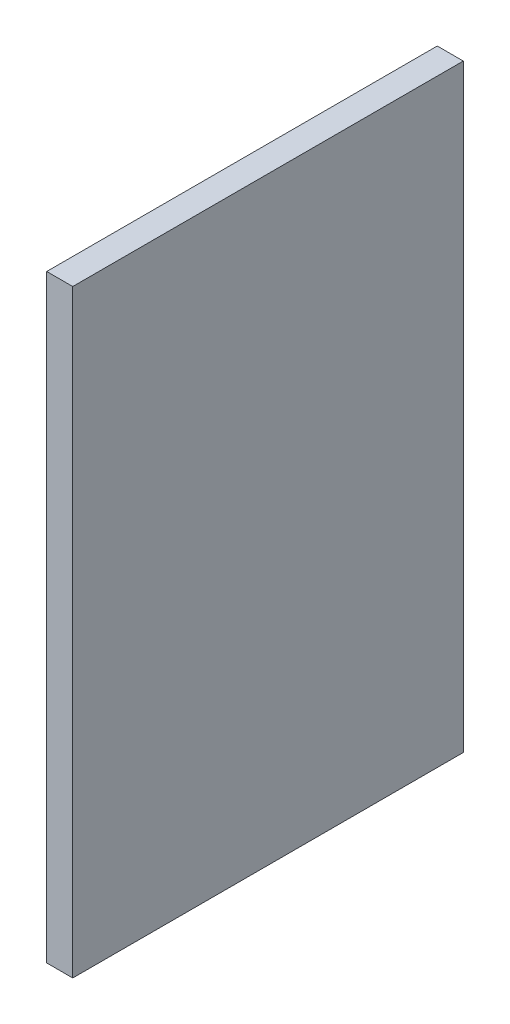
ISO-10303-21;
HEADER;
FILE_DESCRIPTION(('STEP AP214'),'2;1');
FILE_NAME('part.step','',(''),(''),'','','');
FILE_SCHEMA(('AUTOMOTIVE_DESIGN { 1 0 10303 214 1 1 1 1 }'));
ENDSEC;
DATA;
#1=APPLICATION_CONTEXT('core data for automotive mechanical design processes');
#2=APPLICATION_PROTOCOL_DEFINITION('international standard','automotive_design',2000,#1);
#3=PRODUCT_CONTEXT('',#1,'mechanical');
#4=PRODUCT('Part','Part','',(#3));
#5=PRODUCT_RELATED_PRODUCT_CATEGORY('part','',(#4));
#6=PRODUCT_DEFINITION_FORMATION('','',#4);
#7=PRODUCT_DEFINITION_CONTEXT('part definition',#1,'design');
#8=PRODUCT_DEFINITION('design','',#6,#7);
#9=PRODUCT_DEFINITION_SHAPE('','',#8);
#10=(LENGTH_UNIT() NAMED_UNIT(*) SI_UNIT(.MILLI.,.METRE.));
#11=(NAMED_UNIT(*) PLANE_ANGLE_UNIT() SI_UNIT($,.RADIAN.));
#12=(NAMED_UNIT(*) SI_UNIT($,.STERADIAN.) SOLID_ANGLE_UNIT());
#13=UNCERTAINTY_MEASURE_WITH_UNIT(LENGTH_MEASURE(1.E-05),#10,'distance_accuracy_value','');
#14=(GEOMETRIC_REPRESENTATION_CONTEXT(3) GLOBAL_UNCERTAINTY_ASSIGNED_CONTEXT((#13)) GLOBAL_UNIT_ASSIGNED_CONTEXT((#10,
#11,#12)) REPRESENTATION_CONTEXT('',''));
#15=CARTESIAN_POINT('',(0.,0.,0.));
#16=DIRECTION('',(0.,0.,1.));
#17=DIRECTION('',(1.,0.,0.));
#18=AXIS2_PLACEMENT_3D('',#15,#16,#17);
#19=CARTESIAN_POINT('',(0.,292.1,0.));
#20=DIRECTION('',(1.,0.,0.));
#21=DIRECTION('',(0.,0.,-1.));
#22=AXIS2_PLACEMENT_3D('',#19,#20,#21);
#23=PLANE('',#22);
#24=DIRECTION('',(0.,0.,1.));
#25=VECTOR('',#24,1.);
#26=CARTESIAN_POINT('',(0.,0.,0.));
#27=LINE('',#26,#25);
#28=CARTESIAN_POINT('',(0.,0.,-190.5));
#29=VERTEX_POINT('',#28);
#30=CARTESIAN_POINT('',(0.,0.,0.));
#31=VERTEX_POINT('',#30);
#32=EDGE_CURVE('E113',#29,#31,#27,.T.);
#33=ORIENTED_EDGE('',*,*,#32,.T.);
#34=DIRECTION('',(0.,-1.,0.));
#35=VECTOR('',#34,1.);
#36=CARTESIAN_POINT('',(0.,292.1,0.));
#37=LINE('',#36,#35);
#38=CARTESIAN_POINT('',(0.,292.1,0.));
#39=VERTEX_POINT('',#38);
#40=EDGE_CURVE('E11',#39,#31,#37,.T.);
#41=ORIENTED_EDGE('',*,*,#40,.F.);
#42=DIRECTION('',(0.,0.,1.));
#43=VECTOR('',#42,1.);
#44=CARTESIAN_POINT('',(0.,292.1,0.));
#45=LINE('',#44,#43);
#46=CARTESIAN_POINT('',(0.,292.1,-190.5));
#47=VERTEX_POINT('',#46);
#48=EDGE_CURVE('E97',#47,#39,#45,.T.);
#49=ORIENTED_EDGE('',*,*,#48,.F.);
#50=DIRECTION('',(0.,-1.,0.));
#51=VECTOR('',#50,1.);
#52=CARTESIAN_POINT('',(0.,292.1,-190.5));
#53=LINE('',#52,#51);
#54=EDGE_CURVE('E109',#47,#29,#53,.T.);
#55=ORIENTED_EDGE('',*,*,#54,.T.);
#56=EDGE_LOOP('',(#33,#41,#49,#55));
#57=FACE_BOUND('',#56,.T.);
#58=ADVANCED_FACE('F45',(#57),#23,.F.);
#59=CARTESIAN_POINT('',(0.,292.1,0.));
#60=DIRECTION('',(0.,0.,-1.));
#61=DIRECTION('',(-1.,0.,0.));
#62=AXIS2_PLACEMENT_3D('',#59,#60,#61);
#63=PLANE('',#62);
#64=DIRECTION('',(1.,0.,0.));
#65=VECTOR('',#64,1.);
#66=CARTESIAN_POINT('',(0.,0.,0.));
#67=LINE('',#66,#65);
#68=CARTESIAN_POINT('',(12.7,0.,0.));
#69=VERTEX_POINT('',#68);
#70=EDGE_CURVE('E102',#31,#69,#67,.T.);
#71=ORIENTED_EDGE('',*,*,#70,.T.);
#72=DIRECTION('',(0.,-1.,0.));
#73=VECTOR('',#72,1.);
#74=CARTESIAN_POINT('',(12.7,292.1,0.));
#75=LINE('',#74,#73);
#76=CARTESIAN_POINT('',(12.7,292.1,0.));
#77=VERTEX_POINT('',#76);
#78=EDGE_CURVE('E54',#77,#69,#75,.T.);
#79=ORIENTED_EDGE('',*,*,#78,.F.);
#80=DIRECTION('',(1.,0.,0.));
#81=VECTOR('',#80,1.);
#82=CARTESIAN_POINT('',(0.,292.1,0.));
#83=LINE('',#82,#81);
#84=EDGE_CURVE('E92',#39,#77,#83,.T.);
#85=ORIENTED_EDGE('',*,*,#84,.F.);
#86=ORIENTED_EDGE('',*,*,#40,.T.);
#87=EDGE_LOOP('',(#71,#79,#85,#86));
#88=FACE_BOUND('',#87,.T.);
#89=ADVANCED_FACE('F101',(#88),#63,.F.);
#90=CARTESIAN_POINT('',(12.7,292.1,0.));
#91=DIRECTION('',(-1.,0.,0.));
#92=DIRECTION('',(0.,0.,1.));
#93=AXIS2_PLACEMENT_3D('',#90,#91,#92);
#94=PLANE('',#93);
#95=DIRECTION('',(0.,0.,-1.));
#96=VECTOR('',#95,1.);
#97=CARTESIAN_POINT('',(12.7,0.,0.));
#98=LINE('',#97,#96);
#99=CARTESIAN_POINT('',(12.7,0.,-190.5));
#100=VERTEX_POINT('',#99);
#101=EDGE_CURVE('E79',#69,#100,#98,.T.);
#102=ORIENTED_EDGE('',*,*,#101,.T.);
#103=DIRECTION('',(0.,-1.,0.));
#104=VECTOR('',#103,1.);
#105=CARTESIAN_POINT('',(12.7,292.1,-190.5));
#106=LINE('',#105,#104);
#107=CARTESIAN_POINT('',(12.7,292.1,-190.5));
#108=VERTEX_POINT('',#107);
#109=EDGE_CURVE('E104',#108,#100,#106,.T.);
#110=ORIENTED_EDGE('',*,*,#109,.F.);
#111=DIRECTION('',(0.,0.,-1.));
#112=VECTOR('',#111,1.);
#113=CARTESIAN_POINT('',(12.7,292.1,0.));
#114=LINE('',#113,#112);
#115=EDGE_CURVE('E95',#77,#108,#114,.T.);
#116=ORIENTED_EDGE('',*,*,#115,.F.);
#117=ORIENTED_EDGE('',*,*,#78,.T.);
#118=EDGE_LOOP('',(#102,#110,#116,#117));
#119=FACE_BOUND('',#118,.T.);
#120=ADVANCED_FACE('F105',(#119),#94,.F.);
#121=CARTESIAN_POINT('',(0.,292.1,-190.5));
#122=DIRECTION('',(0.,0.,1.));
#123=DIRECTION('',(1.,0.,0.));
#124=AXIS2_PLACEMENT_3D('',#121,#122,#123);
#125=PLANE('',#124);
#126=DIRECTION('',(-1.,0.,0.));
#127=VECTOR('',#126,1.);
#128=CARTESIAN_POINT('',(0.,0.,-190.5));
#129=LINE('',#128,#127);
#130=EDGE_CURVE('E85',#100,#29,#129,.T.);
#131=ORIENTED_EDGE('',*,*,#130,.T.);
#132=ORIENTED_EDGE('',*,*,#54,.F.);
#133=DIRECTION('',(-1.,0.,0.));
#134=VECTOR('',#133,1.);
#135=CARTESIAN_POINT('',(0.,292.1,-190.5));
#136=LINE('',#135,#134);
#137=EDGE_CURVE('E62',#108,#47,#136,.T.);
#138=ORIENTED_EDGE('',*,*,#137,.F.);
#139=ORIENTED_EDGE('',*,*,#109,.T.);
#140=EDGE_LOOP('',(#131,#132,#138,#139));
#141=FACE_BOUND('',#140,.T.);
#142=ADVANCED_FACE('F126',(#141),#125,.F.);
#143=CARTESIAN_POINT('',(0.,292.1,0.));
#144=DIRECTION('',(0.,-1.,0.));
#145=DIRECTION('',(0.,0.,-1.));
#146=AXIS2_PLACEMENT_3D('',#143,#144,#145);
#147=PLANE('',#146);
#148=ORIENTED_EDGE('',*,*,#48,.T.);
#149=ORIENTED_EDGE('',*,*,#84,.T.);
#150=ORIENTED_EDGE('',*,*,#115,.T.);
#151=ORIENTED_EDGE('',*,*,#137,.T.);
#152=EDGE_LOOP('',(#148,#149,#150,#151));
#153=FACE_BOUND('',#152,.T.);
#154=ADVANCED_FACE('F93',(#153),#147,.F.);
#155=CARTESIAN_POINT('',(0.,0.,0.));
#156=DIRECTION('',(0.,-1.,0.));
#157=DIRECTION('',(0.,0.,-1.));
#158=AXIS2_PLACEMENT_3D('',#155,#156,#157);
#159=PLANE('',#158);
#160=ORIENTED_EDGE('',*,*,#32,.F.);
#161=ORIENTED_EDGE('',*,*,#130,.F.);
#162=ORIENTED_EDGE('',*,*,#101,.F.);
#163=ORIENTED_EDGE('',*,*,#70,.F.);
#164=EDGE_LOOP('',(#160,#161,#162,#163));
#165=FACE_BOUND('',#164,.T.);
#166=ADVANCED_FACE('F129',(#165),#159,.T.);
#167=CLOSED_SHELL('',(#58,#89,#120,#142,#154,#166));
#168=MANIFOLD_SOLID_BREP('B2',#167);
#169=ADVANCED_BREP_SHAPE_REPRESENTATION('',(#18,#168),#14);
#170=SHAPE_DEFINITION_REPRESENTATION(#9,#169);
ENDSEC;
END-ISO-10303-21;
